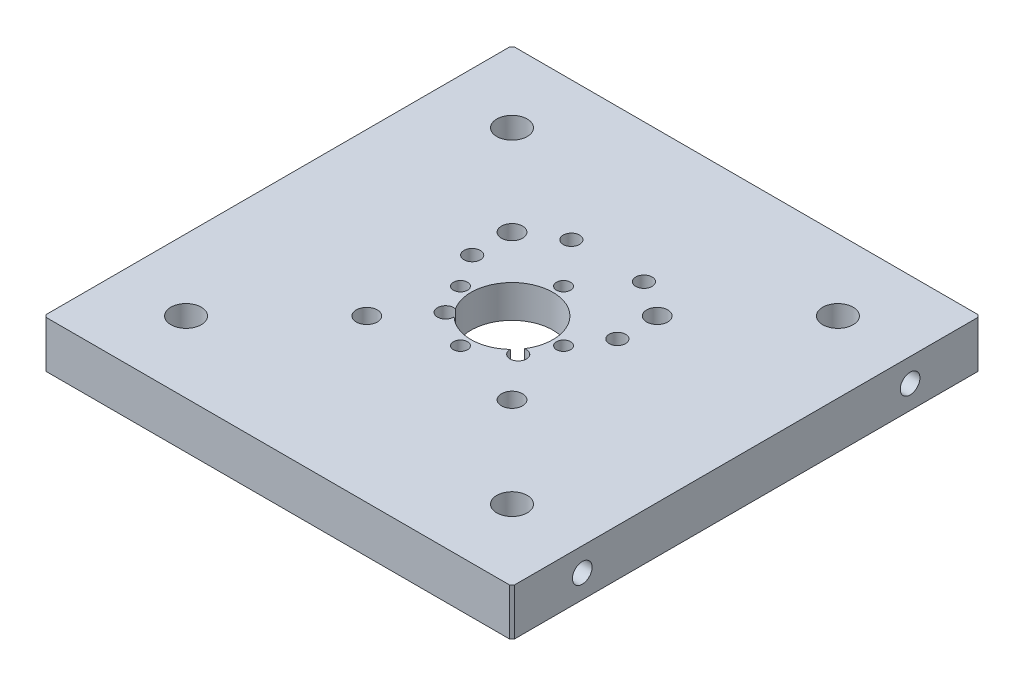
ISO-10303-21;
HEADER;
FILE_DESCRIPTION(('STEP AP214'),'2;1');
FILE_NAME('part.step','',(''),(''),'','','');
FILE_SCHEMA(('AUTOMOTIVE_DESIGN { 1 0 10303 214 1 1 1 1 }'));
ENDSEC;
DATA;
#1=APPLICATION_CONTEXT('core data for automotive mechanical design processes');
#2=APPLICATION_PROTOCOL_DEFINITION('international standard','automotive_design',2000,#1);
#3=PRODUCT_CONTEXT('',#1,'mechanical');
#4=PRODUCT('Part','Part','',(#3));
#5=PRODUCT_RELATED_PRODUCT_CATEGORY('part','',(#4));
#6=PRODUCT_DEFINITION_FORMATION('','',#4);
#7=PRODUCT_DEFINITION_CONTEXT('part definition',#1,'design');
#8=PRODUCT_DEFINITION('design','',#6,#7);
#9=PRODUCT_DEFINITION_SHAPE('','',#8);
#10=(LENGTH_UNIT() NAMED_UNIT(*) SI_UNIT(.MILLI.,.METRE.));
#11=(NAMED_UNIT(*) PLANE_ANGLE_UNIT() SI_UNIT($,.RADIAN.));
#12=(NAMED_UNIT(*) SI_UNIT($,.STERADIAN.) SOLID_ANGLE_UNIT());
#13=UNCERTAINTY_MEASURE_WITH_UNIT(LENGTH_MEASURE(1.E-05),#10,'distance_accuracy_value','');
#14=(GEOMETRIC_REPRESENTATION_CONTEXT(3) GLOBAL_UNCERTAINTY_ASSIGNED_CONTEXT((#13)) GLOBAL_UNIT_ASSIGNED_CONTEXT((#10,
#11,#12)) REPRESENTATION_CONTEXT('',''));
#15=CARTESIAN_POINT('',(0.,0.,0.));
#16=DIRECTION('',(0.,0.,1.));
#17=DIRECTION('',(1.,0.,0.));
#18=AXIS2_PLACEMENT_3D('',#15,#16,#17);
#19=CARTESIAN_POINT('',(0.,-7.7,0.));
#20=DIRECTION('',(0.,1.,0.));
#21=DIRECTION('',(0.,0.,1.));
#22=AXIS2_PLACEMENT_3D('',#19,#20,#21);
#23=CYLINDRICAL_SURFACE('',#22,8.75);
#24=CARTESIAN_POINT('',(0.,-2.,0.));
#25=DIRECTION('',(0.,-1.,0.));
#26=DIRECTION('',(0.,0.,-1.));
#27=AXIS2_PLACEMENT_3D('',#24,#25,#26);
#28=CIRCLE('',#27,8.75);
#29=CARTESIAN_POINT('',(-6.00087551042555,-2.,6.36804468486009));
#30=VERTEX_POINT('',#29);
#31=CARTESIAN_POINT('',(6.00087551042527,-2.,6.36804468486037));
#32=VERTEX_POINT('',#31);
#33=EDGE_CURVE('E191',#30,#32,#28,.F.);
#34=ORIENTED_EDGE('',*,*,#33,.F.);
#35=DIRECTION('',(0.,1.,0.));
#36=VECTOR('',#35,1.);
#37=CARTESIAN_POINT('',(-6.00087551042555,0.,6.36804468486009));
#38=LINE('',#37,#36);
#39=CARTESIAN_POINT('',(-6.00087551042555,5.,6.36804468486009));
#40=VERTEX_POINT('',#39);
#41=EDGE_CURVE('E59',#30,#40,#38,.T.);
#42=ORIENTED_EDGE('',*,*,#41,.T.);
#43=CARTESIAN_POINT('',(0.,5.,0.));
#44=DIRECTION('',(0.,1.,0.));
#45=DIRECTION('',(0.,0.,1.));
#46=AXIS2_PLACEMENT_3D('',#43,#44,#45);
#47=CIRCLE('',#46,8.75);
#48=CARTESIAN_POINT('',(6.00087551042526,5.,6.36804468486037));
#49=VERTEX_POINT('',#48);
#50=EDGE_CURVE('E160',#40,#49,#47,.T.);
#51=ORIENTED_EDGE('',*,*,#50,.T.);
#52=DIRECTION('',(0.,1.,0.));
#53=VECTOR('',#52,1.);
#54=CARTESIAN_POINT('',(6.00087551042526,0.,6.36804468486037));
#55=LINE('',#54,#53);
#56=EDGE_CURVE('E138',#49,#32,#55,.F.);
#57=ORIENTED_EDGE('',*,*,#56,.T.);
#58=EDGE_LOOP('',(#34,#42,#51,#57));
#59=FACE_BOUND('',#58,.T.);
#60=ADVANCED_FACE('F35',(#59),#23,.F.);
#61=CARTESIAN_POINT('',(0.,5.,0.));
#62=DIRECTION('',(0.,1.,0.));
#63=DIRECTION('',(0.,0.,1.));
#64=AXIS2_PLACEMENT_3D('',#61,#62,#63);
#65=PLANE('',#64);
#66=CARTESIAN_POINT('',(0.,5.,-11.));
#67=DIRECTION('',(0.,1.,0.));
#68=DIRECTION('',(0.,0.,1.));
#69=AXIS2_PLACEMENT_3D('',#66,#67,#68);
#70=CIRCLE('',#69,1.5);
#71=CARTESIAN_POINT('',(0.,5.,-9.5));
#72=VERTEX_POINT('',#71);
#73=EDGE_CURVE('E261',#72,#72,#70,.T.);
#74=ORIENTED_EDGE('',*,*,#73,.F.);
#75=EDGE_LOOP('',(#74));
#76=FACE_BOUND('',#75,.T.);
#77=CARTESIAN_POINT('',(-11.,5.,0.));
#78=DIRECTION('',(0.,1.,0.));
#79=DIRECTION('',(0.,0.,1.));
#80=AXIS2_PLACEMENT_3D('',#77,#78,#79);
#81=CIRCLE('',#80,1.5);
#82=CARTESIAN_POINT('',(-11.,5.,1.50000000000002));
#83=VERTEX_POINT('',#82);
#84=EDGE_CURVE('E554',#83,#83,#81,.T.);
#85=ORIENTED_EDGE('',*,*,#84,.F.);
#86=EDGE_LOOP('',(#85));
#87=FACE_BOUND('',#86,.T.);
#88=CARTESIAN_POINT('',(0.,5.,11.));
#89=DIRECTION('',(0.,1.,0.));
#90=DIRECTION('',(0.,0.,1.));
#91=AXIS2_PLACEMENT_3D('',#88,#89,#90);
#92=CIRCLE('',#91,1.5);
#93=CARTESIAN_POINT('',(0.,5.,12.5));
#94=VERTEX_POINT('',#93);
#95=EDGE_CURVE('E557',#94,#94,#92,.T.);
#96=ORIENTED_EDGE('',*,*,#95,.F.);
#97=EDGE_LOOP('',(#96));
#98=FACE_BOUND('',#97,.T.);
#99=CARTESIAN_POINT('',(11.,5.,0.));
#100=DIRECTION('',(0.,1.,0.));
#101=DIRECTION('',(0.,0.,1.));
#102=AXIS2_PLACEMENT_3D('',#99,#100,#101);
#103=CIRCLE('',#102,1.5);
#104=CARTESIAN_POINT('',(11.,5.,1.50000000000002));
#105=VERTEX_POINT('',#104);
#106=EDGE_CURVE('E562',#105,#105,#103,.T.);
#107=ORIENTED_EDGE('',*,*,#106,.F.);
#108=EDGE_LOOP('',(#107));
#109=FACE_BOUND('',#108,.T.);
#110=CARTESIAN_POINT('',(-15.5,5.,15.5));
#111=DIRECTION('',(0.,1.,0.));
#112=DIRECTION('',(0.,0.,1.));
#113=AXIS2_PLACEMENT_3D('',#110,#111,#112);
#114=CIRCLE('',#113,2.25);
#115=CARTESIAN_POINT('',(-15.5,5.,17.75));
#116=VERTEX_POINT('',#115);
#117=EDGE_CURVE('E268',#116,#116,#114,.T.);
#118=ORIENTED_EDGE('',*,*,#117,.F.);
#119=EDGE_LOOP('',(#118));
#120=FACE_BOUND('',#119,.T.);
#121=CARTESIAN_POINT('',(15.4999999999998,5.,15.5000000000002));
#122=DIRECTION('',(0.,1.,0.));
#123=DIRECTION('',(0.,0.,1.));
#124=AXIS2_PLACEMENT_3D('',#121,#122,#123);
#125=CIRCLE('',#124,2.25);
#126=CARTESIAN_POINT('',(15.4999999999998,5.,17.7500000000002));
#127=VERTEX_POINT('',#126);
#128=EDGE_CURVE('E272',#127,#127,#125,.T.);
#129=ORIENTED_EDGE('',*,*,#128,.F.);
#130=EDGE_LOOP('',(#129));
#131=FACE_BOUND('',#130,.T.);
#132=CARTESIAN_POINT('',(15.5000000000001,5.,-15.4999999999999));
#133=DIRECTION('',(0.,1.,0.));
#134=DIRECTION('',(0.,0.,1.));
#135=AXIS2_PLACEMENT_3D('',#132,#133,#134);
#136=CIRCLE('',#135,2.25);
#137=CARTESIAN_POINT('',(15.5000000000001,5.,-13.2499999999999));
#138=VERTEX_POINT('',#137);
#139=EDGE_CURVE('E277',#138,#138,#136,.T.);
#140=ORIENTED_EDGE('',*,*,#139,.F.);
#141=EDGE_LOOP('',(#140));
#142=FACE_BOUND('',#141,.T.);
#143=CARTESIAN_POINT('',(-15.4999999999999,5.,-15.5000000000001));
#144=DIRECTION('',(0.,1.,0.));
#145=DIRECTION('',(0.,0.,1.));
#146=AXIS2_PLACEMENT_3D('',#143,#144,#145);
#147=CIRCLE('',#146,2.25);
#148=CARTESIAN_POINT('',(-15.4999999999999,5.,-13.2500000000001));
#149=VERTEX_POINT('',#148);
#150=EDGE_CURVE('E247',#149,#149,#147,.T.);
#151=ORIENTED_EDGE('',*,*,#150,.F.);
#152=EDGE_LOOP('',(#151));
#153=FACE_BOUND('',#152,.T.);
#154=CARTESIAN_POINT('',(-15.5,5.,-7.));
#155=DIRECTION('',(0.,1.,0.));
#156=DIRECTION('',(0.,0.,1.));
#157=AXIS2_PLACEMENT_3D('',#154,#155,#156);
#158=CIRCLE('',#157,1.75);
#159=CARTESIAN_POINT('',(-15.5,5.,-5.25));
#160=VERTEX_POINT('',#159);
#161=EDGE_CURVE('E256',#160,#160,#158,.T.);
#162=ORIENTED_EDGE('',*,*,#161,.F.);
#163=EDGE_LOOP('',(#162));
#164=FACE_BOUND('',#163,.T.);
#165=CARTESIAN_POINT('',(-7.75000000000016,5.,6.42339375865871));
#166=DIRECTION('',(0.,1.,0.));
#167=DIRECTION('',(0.,0.,1.));
#168=AXIS2_PLACEMENT_3D('',#165,#166,#167);
#169=CIRCLE('',#168,1.75);
#170=CARTESIAN_POINT('',(-7.37102555750396,5.,4.71492123270616));
#171=VERTEX_POINT('',#170);
#172=EDGE_CURVE('E144',#171,#40,#169,.T.);
#173=ORIENTED_EDGE('',*,*,#172,.F.);
#174=CARTESIAN_POINT('',(7.3710255575039,5.,4.71492123270626));
#175=VERTEX_POINT('',#174);
#176=EDGE_CURVE('E151',#175,#171,#47,.T.);
#177=ORIENTED_EDGE('',*,*,#176,.F.);
#178=CARTESIAN_POINT('',(7.74999999999987,5.,6.42339375865887));
#179=DIRECTION('',(0.,1.,0.));
#180=DIRECTION('',(0.,0.,1.));
#181=AXIS2_PLACEMENT_3D('',#178,#179,#180);
#182=CIRCLE('',#181,1.75);
#183=EDGE_CURVE('E135',#49,#175,#182,.T.);
#184=ORIENTED_EDGE('',*,*,#183,.F.);
#185=ORIENTED_EDGE('',*,*,#50,.F.);
#186=EDGE_LOOP('',(#173,#177,#184,#185));
#187=FACE_BOUND('',#186,.T.);
#188=DIRECTION('',(0.,0.,-1.));
#189=VECTOR('',#188,1.);
#190=CARTESIAN_POINT('',(50.,5.,-50.));
#191=LINE('',#190,#189);
#192=CARTESIAN_POINT('',(50.,5.,49.5));
#193=VERTEX_POINT('',#192);
#194=CARTESIAN_POINT('',(50.,5.,-49.5));
#195=VERTEX_POINT('',#194);
#196=EDGE_CURVE('E171',#193,#195,#191,.T.);
#197=ORIENTED_EDGE('',*,*,#196,.T.);
#198=DIRECTION('',(0.707106781186548,0.,0.707106781186548));
#199=VECTOR('',#198,1.);
#200=CARTESIAN_POINT('',(49.75,5.,-49.75));
#201=LINE('',#200,#199);
#202=CARTESIAN_POINT('',(49.5,5.,-50.));
#203=VERTEX_POINT('',#202);
#204=EDGE_CURVE('E203',#195,#203,#201,.F.);
#205=ORIENTED_EDGE('',*,*,#204,.T.);
#206=DIRECTION('',(-1.,0.,0.));
#207=VECTOR('',#206,1.);
#208=CARTESIAN_POINT('',(-50.,5.,-50.));
#209=LINE('',#208,#207);
#210=CARTESIAN_POINT('',(-49.5,5.,-50.));
#211=VERTEX_POINT('',#210);
#212=EDGE_CURVE('E174',#203,#211,#209,.T.);
#213=ORIENTED_EDGE('',*,*,#212,.T.);
#214=DIRECTION('',(0.707106781186548,0.,-0.707106781186548));
#215=VECTOR('',#214,1.);
#216=CARTESIAN_POINT('',(-49.75,5.,-49.75));
#217=LINE('',#216,#215);
#218=CARTESIAN_POINT('',(-50.,5.,-49.5));
#219=VERTEX_POINT('',#218);
#220=EDGE_CURVE('E197',#211,#219,#217,.F.);
#221=ORIENTED_EDGE('',*,*,#220,.T.);
#222=DIRECTION('',(0.,0.,1.));
#223=VECTOR('',#222,1.);
#224=CARTESIAN_POINT('',(-50.,5.,-50.));
#225=LINE('',#224,#223);
#226=CARTESIAN_POINT('',(-50.,5.,49.5));
#227=VERTEX_POINT('',#226);
#228=EDGE_CURVE('E159',#219,#227,#225,.T.);
#229=ORIENTED_EDGE('',*,*,#228,.T.);
#230=DIRECTION('',(-0.707106781186548,0.,-0.707106781186548));
#231=VECTOR('',#230,1.);
#232=CARTESIAN_POINT('',(-49.75,5.,49.75));
#233=LINE('',#232,#231);
#234=CARTESIAN_POINT('',(-49.5,5.,50.));
#235=VERTEX_POINT('',#234);
#236=EDGE_CURVE('E199',#227,#235,#233,.F.);
#237=ORIENTED_EDGE('',*,*,#236,.T.);
#238=DIRECTION('',(1.,0.,0.));
#239=VECTOR('',#238,1.);
#240=CARTESIAN_POINT('',(-50.,5.,50.));
#241=LINE('',#240,#239);
#242=CARTESIAN_POINT('',(49.5,5.,50.));
#243=VERTEX_POINT('',#242);
#244=EDGE_CURVE('E163',#235,#243,#241,.T.);
#245=ORIENTED_EDGE('',*,*,#244,.T.);
#246=DIRECTION('',(-0.707106781186548,0.,0.707106781186548));
#247=VECTOR('',#246,1.);
#248=CARTESIAN_POINT('',(49.75,5.,49.75));
#249=LINE('',#248,#247);
#250=EDGE_CURVE('E201',#243,#193,#249,.F.);
#251=ORIENTED_EDGE('',*,*,#250,.T.);
#252=EDGE_LOOP('',(#197,#205,#213,#221,#229,#237,#245,#251));
#253=FACE_BOUND('',#252,.T.);
#254=CARTESIAN_POINT('',(-34.798492469143,5.,34.798492469143));
#255=DIRECTION('',(0.,1.,0.));
#256=DIRECTION('',(0.,0.,1.));
#257=AXIS2_PLACEMENT_3D('',#254,#255,#256);
#258=CIRCLE('',#257,3.25);
#259=CARTESIAN_POINT('',(-34.798492469143,5.,38.048492469143));
#260=VERTEX_POINT('',#259);
#261=EDGE_CURVE('E324',#260,#260,#258,.T.);
#262=ORIENTED_EDGE('',*,*,#261,.F.);
#263=EDGE_LOOP('',(#262));
#264=FACE_BOUND('',#263,.T.);
#265=CARTESIAN_POINT('',(34.798492469143,5.,34.798492469143));
#266=DIRECTION('',(0.,1.,0.));
#267=DIRECTION('',(0.,0.,-1.));
#268=AXIS2_PLACEMENT_3D('',#265,#266,#267);
#269=CIRCLE('',#268,3.25);
#270=CARTESIAN_POINT('',(34.798492469143,5.,31.548492469143));
#271=VERTEX_POINT('',#270);
#272=EDGE_CURVE('E332',#271,#271,#269,.T.);
#273=ORIENTED_EDGE('',*,*,#272,.F.);
#274=EDGE_LOOP('',(#273));
#275=FACE_BOUND('',#274,.T.);
#276=CARTESIAN_POINT('',(-34.798492469143,5.,-34.798492469143));
#277=DIRECTION('',(0.,1.,0.));
#278=DIRECTION('',(0.,0.,-1.));
#279=AXIS2_PLACEMENT_3D('',#276,#277,#278);
#280=CIRCLE('',#279,3.25);
#281=CARTESIAN_POINT('',(-34.798492469143,5.,-38.048492469143));
#282=VERTEX_POINT('',#281);
#283=EDGE_CURVE('E329',#282,#282,#280,.T.);
#284=ORIENTED_EDGE('',*,*,#283,.F.);
#285=EDGE_LOOP('',(#284));
#286=FACE_BOUND('',#285,.T.);
#287=CARTESIAN_POINT('',(34.798492469143,5.,-34.798492469143));
#288=DIRECTION('',(0.,1.,0.));
#289=DIRECTION('',(0.,0.,1.));
#290=AXIS2_PLACEMENT_3D('',#287,#288,#289);
#291=CIRCLE('',#290,3.25);
#292=CARTESIAN_POINT('',(34.798492469143,5.,-31.548492469143));
#293=VERTEX_POINT('',#292);
#294=EDGE_CURVE('E325',#293,#293,#291,.T.);
#295=ORIENTED_EDGE('',*,*,#294,.F.);
#296=EDGE_LOOP('',(#295));
#297=FACE_BOUND('',#296,.T.);
#298=CARTESIAN_POINT('',(7.75000000000006,5.,-20.4233937586588));
#299=DIRECTION('',(0.,1.,0.));
#300=DIRECTION('',(0.,0.,1.));
#301=AXIS2_PLACEMENT_3D('',#298,#299,#300);
#302=CIRCLE('',#301,1.75);
#303=CARTESIAN_POINT('',(7.75000000000006,5.,-18.6733937586588));
#304=VERTEX_POINT('',#303);
#305=EDGE_CURVE('E232',#304,#304,#302,.T.);
#306=ORIENTED_EDGE('',*,*,#305,.F.);
#307=EDGE_LOOP('',(#306));
#308=FACE_BOUND('',#307,.T.);
#309=CARTESIAN_POINT('',(-7.74999999999997,5.,-20.4233937586588));
#310=DIRECTION('',(0.,1.,0.));
#311=DIRECTION('',(0.,0.,1.));
#312=AXIS2_PLACEMENT_3D('',#309,#310,#311);
#313=CIRCLE('',#312,1.75);
#314=CARTESIAN_POINT('',(-7.74999999999997,5.,-18.6733937586588));
#315=VERTEX_POINT('',#314);
#316=EDGE_CURVE('E283',#315,#315,#313,.T.);
#317=ORIENTED_EDGE('',*,*,#316,.F.);
#318=EDGE_LOOP('',(#317));
#319=FACE_BOUND('',#318,.T.);
#320=CARTESIAN_POINT('',(15.5,5.,-7.00000000000001));
#321=DIRECTION('',(0.,-1.,0.));
#322=DIRECTION('',(0.,0.,-1.));
#323=AXIS2_PLACEMENT_3D('',#320,#321,#322);
#324=CIRCLE('',#323,1.75);
#325=CARTESIAN_POINT('',(15.5,5.,-8.75000000000001));
#326=VERTEX_POINT('',#325);
#327=EDGE_CURVE('E143',#326,#326,#324,.T.);
#328=ORIENTED_EDGE('',*,*,#327,.T.);
#329=EDGE_LOOP('',(#328));
#330=FACE_BOUND('',#329,.T.);
#331=ADVANCED_FACE('F157',(#76,#87,#98,#109,#120,#131,#142,#153,#164,#187,#253,#264,#275,#286,
#297,#308,#319,#330),#65,.T.);
#332=CARTESIAN_POINT('',(0.,-2.,0.));
#333=DIRECTION('',(0.,-1.,0.));
#334=DIRECTION('',(0.,0.,-1.));
#335=AXIS2_PLACEMENT_3D('',#332,#333,#334);
#336=PLANE('',#335);
#337=CARTESIAN_POINT('',(0.,-2.,-11.));
#338=DIRECTION('',(0.,-1.,0.));
#339=DIRECTION('',(0.,0.,-1.));
#340=AXIS2_PLACEMENT_3D('',#337,#338,#339);
#341=CIRCLE('',#340,1.5);
#342=CARTESIAN_POINT('',(0.,-2.,-12.5));
#343=VERTEX_POINT('',#342);
#344=EDGE_CURVE('E39',#343,#343,#341,.T.);
#345=ORIENTED_EDGE('',*,*,#344,.F.);
#346=EDGE_LOOP('',(#345));
#347=FACE_BOUND('',#346,.T.);
#348=CARTESIAN_POINT('',(-11.,-2.,0.));
#349=DIRECTION('',(0.,-1.,0.));
#350=DIRECTION('',(0.,0.,-1.));
#351=AXIS2_PLACEMENT_3D('',#348,#349,#350);
#352=CIRCLE('',#351,1.5);
#353=CARTESIAN_POINT('',(-11.,-2.,-1.49999999999998));
#354=VERTEX_POINT('',#353);
#355=EDGE_CURVE('E263',#354,#354,#352,.T.);
#356=ORIENTED_EDGE('',*,*,#355,.F.);
#357=EDGE_LOOP('',(#356));
#358=FACE_BOUND('',#357,.T.);
#359=CARTESIAN_POINT('',(0.,-2.,11.));
#360=DIRECTION('',(0.,-1.,0.));
#361=DIRECTION('',(0.,0.,-1.));
#362=AXIS2_PLACEMENT_3D('',#359,#360,#361);
#363=CIRCLE('',#362,1.5);
#364=CARTESIAN_POINT('',(0.,-2.,9.5));
#365=VERTEX_POINT('',#364);
#366=EDGE_CURVE('E260',#365,#365,#363,.T.);
#367=ORIENTED_EDGE('',*,*,#366,.F.);
#368=EDGE_LOOP('',(#367));
#369=FACE_BOUND('',#368,.T.);
#370=CARTESIAN_POINT('',(11.,-2.,0.));
#371=DIRECTION('',(0.,-1.,0.));
#372=DIRECTION('',(0.,0.,-1.));
#373=AXIS2_PLACEMENT_3D('',#370,#371,#372);
#374=CIRCLE('',#373,1.5);
#375=CARTESIAN_POINT('',(11.,-2.,-1.49999999999998));
#376=VERTEX_POINT('',#375);
#377=EDGE_CURVE('E257',#376,#376,#374,.T.);
#378=ORIENTED_EDGE('',*,*,#377,.F.);
#379=EDGE_LOOP('',(#378));
#380=FACE_BOUND('',#379,.T.);
#381=CARTESIAN_POINT('',(-15.5,-2.,15.5));
#382=DIRECTION('',(0.,-1.,0.));
#383=DIRECTION('',(0.,0.,-1.));
#384=AXIS2_PLACEMENT_3D('',#381,#382,#383);
#385=CIRCLE('',#384,2.25);
#386=CARTESIAN_POINT('',(-15.5,-2.,13.25));
#387=VERTEX_POINT('',#386);
#388=EDGE_CURVE('E253',#387,#387,#385,.T.);
#389=ORIENTED_EDGE('',*,*,#388,.F.);
#390=EDGE_LOOP('',(#389));
#391=FACE_BOUND('',#390,.T.);
#392=CARTESIAN_POINT('',(15.4999999999998,-2.,15.5000000000002));
#393=DIRECTION('',(0.,-1.,0.));
#394=DIRECTION('',(0.,0.,-1.));
#395=AXIS2_PLACEMENT_3D('',#392,#393,#394);
#396=CIRCLE('',#395,2.25);
#397=CARTESIAN_POINT('',(15.4999999999998,-2.,13.2500000000002));
#398=VERTEX_POINT('',#397);
#399=EDGE_CURVE('E250',#398,#398,#396,.T.);
#400=ORIENTED_EDGE('',*,*,#399,.F.);
#401=EDGE_LOOP('',(#400));
#402=FACE_BOUND('',#401,.T.);
#403=CARTESIAN_POINT('',(15.5000000000001,-2.,-15.4999999999999));
#404=DIRECTION('',(0.,-1.,0.));
#405=DIRECTION('',(0.,0.,-1.));
#406=AXIS2_PLACEMENT_3D('',#403,#404,#405);
#407=CIRCLE('',#406,2.25);
#408=CARTESIAN_POINT('',(15.5000000000001,-2.,-17.7499999999999));
#409=VERTEX_POINT('',#408);
#410=EDGE_CURVE('E246',#409,#409,#407,.T.);
#411=ORIENTED_EDGE('',*,*,#410,.F.);
#412=EDGE_LOOP('',(#411));
#413=FACE_BOUND('',#412,.T.);
#414=CARTESIAN_POINT('',(-15.4999999999999,-2.,-15.5000000000001));
#415=DIRECTION('',(0.,-1.,0.));
#416=DIRECTION('',(0.,0.,-1.));
#417=AXIS2_PLACEMENT_3D('',#414,#415,#416);
#418=CIRCLE('',#417,2.25);
#419=CARTESIAN_POINT('',(-15.4999999999999,-2.,-17.75));
#420=VERTEX_POINT('',#419);
#421=EDGE_CURVE('E243',#420,#420,#418,.T.);
#422=ORIENTED_EDGE('',*,*,#421,.F.);
#423=EDGE_LOOP('',(#422));
#424=FACE_BOUND('',#423,.T.);
#425=CARTESIAN_POINT('',(-15.5,-2.,-7.));
#426=DIRECTION('',(0.,-1.,0.));
#427=DIRECTION('',(0.,0.,-1.));
#428=AXIS2_PLACEMENT_3D('',#425,#426,#427);
#429=CIRCLE('',#428,1.75);
#430=CARTESIAN_POINT('',(-15.5,-2.,-8.75));
#431=VERTEX_POINT('',#430);
#432=EDGE_CURVE('E239',#431,#431,#429,.T.);
#433=ORIENTED_EDGE('',*,*,#432,.F.);
#434=EDGE_LOOP('',(#433));
#435=FACE_BOUND('',#434,.T.);
#436=CARTESIAN_POINT('',(-7.75000000000016,-2.,6.42339375865871));
#437=DIRECTION('',(0.,-1.,0.));
#438=DIRECTION('',(0.,0.,-1.));
#439=AXIS2_PLACEMENT_3D('',#436,#437,#438);
#440=CIRCLE('',#439,1.75);
#441=CARTESIAN_POINT('',(-7.37102555750396,-2.,4.71492123270616));
#442=VERTEX_POINT('',#441);
#443=EDGE_CURVE('E11',#30,#442,#440,.T.);
#444=ORIENTED_EDGE('',*,*,#443,.F.);
#445=ORIENTED_EDGE('',*,*,#33,.T.);
#446=CARTESIAN_POINT('',(7.74999999999987,-2.,6.42339375865887));
#447=DIRECTION('',(0.,-1.,0.));
#448=DIRECTION('',(0.,0.,-1.));
#449=AXIS2_PLACEMENT_3D('',#446,#447,#448);
#450=CIRCLE('',#449,1.75);
#451=CARTESIAN_POINT('',(7.3710255575039,-2.,4.71492123270627));
#452=VERTEX_POINT('',#451);
#453=EDGE_CURVE('E44',#452,#32,#450,.T.);
#454=ORIENTED_EDGE('',*,*,#453,.F.);
#455=EDGE_CURVE('E153',#452,#442,#28,.F.);
#456=ORIENTED_EDGE('',*,*,#455,.T.);
#457=EDGE_LOOP('',(#444,#445,#454,#456));
#458=FACE_BOUND('',#457,.T.);
#459=CARTESIAN_POINT('',(0.,-2.,0.));
#460=DIRECTION('',(0.,-1.,0.));
#461=DIRECTION('',(0.,0.,-1.));
#462=AXIS2_PLACEMENT_3D('',#459,#460,#461);
#463=CIRCLE('',#462,37.5);
#464=CARTESIAN_POINT('',(0.,-2.,-37.5));
#465=VERTEX_POINT('',#464);
#466=EDGE_CURVE('E192',#465,#465,#463,.T.);
#467=ORIENTED_EDGE('',*,*,#466,.T.);
#468=EDGE_LOOP('',(#467));
#469=FACE_BOUND('',#468,.T.);
#470=CARTESIAN_POINT('',(7.75000000000006,-2.,-20.4233937586588));
#471=DIRECTION('',(0.,-1.,0.));
#472=DIRECTION('',(0.,0.,-1.));
#473=AXIS2_PLACEMENT_3D('',#470,#471,#472);
#474=CIRCLE('',#473,1.75);
#475=CARTESIAN_POINT('',(7.75000000000006,-2.,-22.1733937586588));
#476=VERTEX_POINT('',#475);
#477=EDGE_CURVE('E228',#476,#476,#474,.T.);
#478=ORIENTED_EDGE('',*,*,#477,.F.);
#479=EDGE_LOOP('',(#478));
#480=FACE_BOUND('',#479,.T.);
#481=CARTESIAN_POINT('',(-7.74999999999997,-2.,-20.4233937586588));
#482=DIRECTION('',(0.,-1.,0.));
#483=DIRECTION('',(0.,0.,-1.));
#484=AXIS2_PLACEMENT_3D('',#481,#482,#483);
#485=CIRCLE('',#484,1.75);
#486=CARTESIAN_POINT('',(-7.74999999999997,-2.,-22.1733937586588));
#487=VERTEX_POINT('',#486);
#488=EDGE_CURVE('E231',#487,#487,#485,.T.);
#489=ORIENTED_EDGE('',*,*,#488,.F.);
#490=EDGE_LOOP('',(#489));
#491=FACE_BOUND('',#490,.T.);
#492=CARTESIAN_POINT('',(15.5,-2.,-7.00000000000001));
#493=DIRECTION('',(0.,-1.,0.));
#494=DIRECTION('',(0.,0.,-1.));
#495=AXIS2_PLACEMENT_3D('',#492,#493,#494);
#496=CIRCLE('',#495,1.75);
#497=CARTESIAN_POINT('',(15.5,-2.,-8.75000000000001));
#498=VERTEX_POINT('',#497);
#499=EDGE_CURVE('E235',#498,#498,#496,.F.);
#500=ORIENTED_EDGE('',*,*,#499,.T.);
#501=EDGE_LOOP('',(#500));
#502=FACE_BOUND('',#501,.T.);
#503=ADVANCED_FACE('F372',(#347,#358,#369,#380,#391,#402,#413,#424,#435,#458,#469,#480,#491,
#502),#336,.T.);
#504=ORIENTED_EDGE('',*,*,#176,.T.);
#505=DIRECTION('',(0.,1.,0.));
#506=VECTOR('',#505,1.);
#507=CARTESIAN_POINT('',(-7.37102555750396,0.,4.71492123270616));
#508=LINE('',#507,#506);
#509=EDGE_CURVE('E154',#171,#442,#508,.F.);
#510=ORIENTED_EDGE('',*,*,#509,.T.);
#511=ORIENTED_EDGE('',*,*,#455,.F.);
#512=DIRECTION('',(0.,1.,0.));
#513=VECTOR('',#512,1.);
#514=CARTESIAN_POINT('',(7.3710255575039,0.,4.71492123270626));
#515=LINE('',#514,#513);
#516=EDGE_CURVE('E52',#452,#175,#515,.T.);
#517=ORIENTED_EDGE('',*,*,#516,.T.);
#518=EDGE_LOOP('',(#504,#510,#511,#517));
#519=FACE_BOUND('',#518,.T.);
#520=ADVANCED_FACE('F149',(#519),#23,.F.);
#521=CARTESIAN_POINT('',(-50.,-5.,-50.));
#522=DIRECTION('',(-1.,0.,0.));
#523=DIRECTION('',(0.,0.,1.));
#524=AXIS2_PLACEMENT_3D('',#521,#522,#523);
#525=PLANE('',#524);
#526=CARTESIAN_POINT('',(-50.,0.,-35.));
#527=DIRECTION('',(-1.,0.,0.));
#528=DIRECTION('',(0.,0.,1.));
#529=AXIS2_PLACEMENT_3D('',#526,#527,#528);
#530=CIRCLE('',#529,2.1);
#531=CARTESIAN_POINT('',(-50.,0.,-32.9));
#532=VERTEX_POINT('',#531);
#533=EDGE_CURVE('E312',#532,#532,#530,.T.);
#534=ORIENTED_EDGE('',*,*,#533,.F.);
#535=EDGE_LOOP('',(#534));
#536=FACE_BOUND('',#535,.T.);
#537=CARTESIAN_POINT('',(-50.,0.,35.));
#538=DIRECTION('',(-1.,0.,0.));
#539=DIRECTION('',(0.,0.,1.));
#540=AXIS2_PLACEMENT_3D('',#537,#538,#539);
#541=CIRCLE('',#540,2.1);
#542=CARTESIAN_POINT('',(-50.,0.,37.1));
#543=VERTEX_POINT('',#542);
#544=EDGE_CURVE('E318',#543,#543,#541,.T.);
#545=ORIENTED_EDGE('',*,*,#544,.F.);
#546=EDGE_LOOP('',(#545));
#547=FACE_BOUND('',#546,.T.);
#548=DIRECTION('',(0.,0.,1.));
#549=VECTOR('',#548,1.);
#550=CARTESIAN_POINT('',(-50.,-5.,-50.));
#551=LINE('',#550,#549);
#552=CARTESIAN_POINT('',(-50.,-5.,-49.5));
#553=VERTEX_POINT('',#552);
#554=CARTESIAN_POINT('',(-50.,-5.,49.5));
#555=VERTEX_POINT('',#554);
#556=EDGE_CURVE('E177',#553,#555,#551,.T.);
#557=ORIENTED_EDGE('',*,*,#556,.T.);
#558=DIRECTION('',(0.,1.,0.));
#559=VECTOR('',#558,1.);
#560=CARTESIAN_POINT('',(-50.,-5.,49.5));
#561=LINE('',#560,#559);
#562=EDGE_CURVE('E225',#555,#227,#561,.T.);
#563=ORIENTED_EDGE('',*,*,#562,.T.);
#564=ORIENTED_EDGE('',*,*,#228,.F.);
#565=DIRECTION('',(0.,-1.,0.));
#566=VECTOR('',#565,1.);
#567=CARTESIAN_POINT('',(-50.,-5.,-49.5));
#568=LINE('',#567,#566);
#569=EDGE_CURVE('E223',#219,#553,#568,.T.);
#570=ORIENTED_EDGE('',*,*,#569,.T.);
#571=EDGE_LOOP('',(#557,#563,#564,#570));
#572=FACE_BOUND('',#571,.T.);
#573=ADVANCED_FACE('F378',(#536,#547,#572),#525,.T.);
#574=CARTESIAN_POINT('',(-50.,-5.,-50.));
#575=DIRECTION('',(0.,0.,-1.));
#576=DIRECTION('',(-1.,0.,0.));
#577=AXIS2_PLACEMENT_3D('',#574,#575,#576);
#578=PLANE('',#577);
#579=ORIENTED_EDGE('',*,*,#212,.F.);
#580=DIRECTION('',(0.,-1.,0.));
#581=VECTOR('',#580,1.);
#582=CARTESIAN_POINT('',(49.5,-5.,-50.));
#583=LINE('',#582,#581);
#584=CARTESIAN_POINT('',(49.5,-5.,-50.));
#585=VERTEX_POINT('',#584);
#586=EDGE_CURVE('E208',#203,#585,#583,.T.);
#587=ORIENTED_EDGE('',*,*,#586,.T.);
#588=DIRECTION('',(-1.,0.,0.));
#589=VECTOR('',#588,1.);
#590=CARTESIAN_POINT('',(-50.,-5.,-50.));
#591=LINE('',#590,#589);
#592=CARTESIAN_POINT('',(-49.5,-5.,-50.));
#593=VERTEX_POINT('',#592);
#594=EDGE_CURVE('E186',#585,#593,#591,.T.);
#595=ORIENTED_EDGE('',*,*,#594,.T.);
#596=DIRECTION('',(0.,1.,0.));
#597=VECTOR('',#596,1.);
#598=CARTESIAN_POINT('',(-49.5,-5.,-50.));
#599=LINE('',#598,#597);
#600=EDGE_CURVE('E205',#593,#211,#599,.T.);
#601=ORIENTED_EDGE('',*,*,#600,.T.);
#602=EDGE_LOOP('',(#579,#587,#595,#601));
#603=FACE_BOUND('',#602,.T.);
#604=ADVANCED_FACE('F383',(#603),#578,.T.);
#605=CARTESIAN_POINT('',(50.,-5.,-50.));
#606=DIRECTION('',(1.,0.,0.));
#607=DIRECTION('',(0.,0.,-1.));
#608=AXIS2_PLACEMENT_3D('',#605,#606,#607);
#609=PLANE('',#608);
#610=CARTESIAN_POINT('',(50.,0.,-35.));
#611=DIRECTION('',(1.,0.,0.));
#612=DIRECTION('',(0.,0.,-1.));
#613=AXIS2_PLACEMENT_3D('',#610,#611,#612);
#614=CIRCLE('',#613,2.1);
#615=CARTESIAN_POINT('',(50.,0.,-37.1));
#616=VERTEX_POINT('',#615);
#617=EDGE_CURVE('E242',#616,#616,#614,.T.);
#618=ORIENTED_EDGE('',*,*,#617,.F.);
#619=EDGE_LOOP('',(#618));
#620=FACE_BOUND('',#619,.T.);
#621=CARTESIAN_POINT('',(50.,0.,35.));
#622=DIRECTION('',(1.,0.,0.));
#623=DIRECTION('',(0.,0.,-1.));
#624=AXIS2_PLACEMENT_3D('',#621,#622,#623);
#625=CIRCLE('',#624,2.1);
#626=CARTESIAN_POINT('',(50.,0.,32.9));
#627=VERTEX_POINT('',#626);
#628=EDGE_CURVE('E301',#627,#627,#625,.T.);
#629=ORIENTED_EDGE('',*,*,#628,.F.);
#630=EDGE_LOOP('',(#629));
#631=FACE_BOUND('',#630,.T.);
#632=DIRECTION('',(0.,0.,-1.));
#633=VECTOR('',#632,1.);
#634=CARTESIAN_POINT('',(50.,-5.,-50.));
#635=LINE('',#634,#633);
#636=CARTESIAN_POINT('',(50.,-5.,49.5));
#637=VERTEX_POINT('',#636);
#638=CARTESIAN_POINT('',(50.,-5.,-49.5));
#639=VERTEX_POINT('',#638);
#640=EDGE_CURVE('E183',#637,#639,#635,.T.);
#641=ORIENTED_EDGE('',*,*,#640,.T.);
#642=DIRECTION('',(0.,1.,0.));
#643=VECTOR('',#642,1.);
#644=CARTESIAN_POINT('',(50.,-5.,-49.5));
#645=LINE('',#644,#643);
#646=EDGE_CURVE('E194',#639,#195,#645,.T.);
#647=ORIENTED_EDGE('',*,*,#646,.T.);
#648=ORIENTED_EDGE('',*,*,#196,.F.);
#649=DIRECTION('',(0.,-1.,0.));
#650=VECTOR('',#649,1.);
#651=CARTESIAN_POINT('',(50.,-5.,49.5));
#652=LINE('',#651,#650);
#653=EDGE_CURVE('E189',#193,#637,#652,.T.);
#654=ORIENTED_EDGE('',*,*,#653,.T.);
#655=EDGE_LOOP('',(#641,#647,#648,#654));
#656=FACE_BOUND('',#655,.T.);
#657=ADVANCED_FACE('F439',(#620,#631,#656),#609,.T.);
#658=CARTESIAN_POINT('',(-50.,-5.,50.));
#659=DIRECTION('',(0.,0.,1.));
#660=DIRECTION('',(1.,0.,0.));
#661=AXIS2_PLACEMENT_3D('',#658,#659,#660);
#662=PLANE('',#661);
#663=DIRECTION('',(1.,0.,0.));
#664=VECTOR('',#663,1.);
#665=CARTESIAN_POINT('',(-50.,-5.,50.));
#666=LINE('',#665,#664);
#667=CARTESIAN_POINT('',(-49.5,-5.,50.));
#668=VERTEX_POINT('',#667);
#669=CARTESIAN_POINT('',(49.5,-5.,50.));
#670=VERTEX_POINT('',#669);
#671=EDGE_CURVE('E180',#668,#670,#666,.T.);
#672=ORIENTED_EDGE('',*,*,#671,.T.);
#673=DIRECTION('',(0.,1.,0.));
#674=VECTOR('',#673,1.);
#675=CARTESIAN_POINT('',(49.5,-5.,50.));
#676=LINE('',#675,#674);
#677=EDGE_CURVE('E220',#670,#243,#676,.T.);
#678=ORIENTED_EDGE('',*,*,#677,.T.);
#679=ORIENTED_EDGE('',*,*,#244,.F.);
#680=DIRECTION('',(0.,-1.,0.));
#681=VECTOR('',#680,1.);
#682=CARTESIAN_POINT('',(-49.5,-5.,50.));
#683=LINE('',#682,#681);
#684=EDGE_CURVE('E218',#235,#668,#683,.T.);
#685=ORIENTED_EDGE('',*,*,#684,.T.);
#686=EDGE_LOOP('',(#672,#678,#679,#685));
#687=FACE_BOUND('',#686,.T.);
#688=ADVANCED_FACE('F430',(#687),#662,.T.);
#689=CARTESIAN_POINT('',(0.,-5.,0.));
#690=DIRECTION('',(0.,1.,0.));
#691=DIRECTION('',(0.,0.,1.));
#692=AXIS2_PLACEMENT_3D('',#689,#690,#691);
#693=PLANE('',#692);
#694=CARTESIAN_POINT('',(0.,-5.,0.));
#695=DIRECTION('',(0.,-1.,0.));
#696=DIRECTION('',(0.,0.,-1.));
#697=AXIS2_PLACEMENT_3D('',#694,#695,#696);
#698=CIRCLE('',#697,37.5);
#699=CARTESIAN_POINT('',(0.,-5.,-37.5));
#700=VERTEX_POINT('',#699);
#701=EDGE_CURVE('E307',#700,#700,#698,.T.);
#702=ORIENTED_EDGE('',*,*,#701,.F.);
#703=EDGE_LOOP('',(#702));
#704=FACE_BOUND('',#703,.T.);
#705=CARTESIAN_POINT('',(34.798492469143,-5.,-34.798492469143));
#706=DIRECTION('',(0.,1.,0.));
#707=DIRECTION('',(0.,0.,1.));
#708=AXIS2_PLACEMENT_3D('',#705,#706,#707);
#709=CIRCLE('',#708,3.25);
#710=CARTESIAN_POINT('',(34.798492469143,-5.,-31.548492469143));
#711=VERTEX_POINT('',#710);
#712=EDGE_CURVE('E165',#711,#711,#709,.T.);
#713=ORIENTED_EDGE('',*,*,#712,.T.);
#714=EDGE_LOOP('',(#713));
#715=FACE_BOUND('',#714,.T.);
#716=CARTESIAN_POINT('',(-34.798492469143,-5.,-34.798492469143));
#717=DIRECTION('',(0.,1.,0.));
#718=DIRECTION('',(0.,0.,1.));
#719=AXIS2_PLACEMENT_3D('',#716,#717,#718);
#720=CIRCLE('',#719,3.25);
#721=CARTESIAN_POINT('',(-34.798492469143,-5.,-31.548492469143));
#722=VERTEX_POINT('',#721);
#723=EDGE_CURVE('E341',#722,#722,#720,.T.);
#724=ORIENTED_EDGE('',*,*,#723,.T.);
#725=EDGE_LOOP('',(#724));
#726=FACE_BOUND('',#725,.T.);
#727=CARTESIAN_POINT('',(34.798492469143,-5.,34.798492469143));
#728=DIRECTION('',(0.,1.,0.));
#729=DIRECTION('',(0.,0.,1.));
#730=AXIS2_PLACEMENT_3D('',#727,#728,#729);
#731=CIRCLE('',#730,3.25);
#732=CARTESIAN_POINT('',(34.798492469143,-5.,38.048492469143));
#733=VERTEX_POINT('',#732);
#734=EDGE_CURVE('E339',#733,#733,#731,.T.);
#735=ORIENTED_EDGE('',*,*,#734,.T.);
#736=EDGE_LOOP('',(#735));
#737=FACE_BOUND('',#736,.T.);
#738=CARTESIAN_POINT('',(-34.798492469143,-5.,34.798492469143));
#739=DIRECTION('',(0.,1.,0.));
#740=DIRECTION('',(0.,0.,1.));
#741=AXIS2_PLACEMENT_3D('',#738,#739,#740);
#742=CIRCLE('',#741,3.25);
#743=CARTESIAN_POINT('',(-34.798492469143,-5.,38.048492469143));
#744=VERTEX_POINT('',#743);
#745=EDGE_CURVE('E328',#744,#744,#742,.T.);
#746=ORIENTED_EDGE('',*,*,#745,.T.);
#747=EDGE_LOOP('',(#746));
#748=FACE_BOUND('',#747,.T.);
#749=ORIENTED_EDGE('',*,*,#594,.F.);
#750=DIRECTION('',(-0.707106781186548,0.,-0.707106781186548));
#751=VECTOR('',#750,1.);
#752=CARTESIAN_POINT('',(50.,-5.,-49.5));
#753=LINE('',#752,#751);
#754=EDGE_CURVE('E216',#585,#639,#753,.F.);
#755=ORIENTED_EDGE('',*,*,#754,.T.);
#756=ORIENTED_EDGE('',*,*,#640,.F.);
#757=DIRECTION('',(0.707106781186548,0.,-0.707106781186548));
#758=VECTOR('',#757,1.);
#759=CARTESIAN_POINT('',(49.5,-5.,50.));
#760=LINE('',#759,#758);
#761=EDGE_CURVE('E214',#637,#670,#760,.F.);
#762=ORIENTED_EDGE('',*,*,#761,.T.);
#763=ORIENTED_EDGE('',*,*,#671,.F.);
#764=DIRECTION('',(0.707106781186548,0.,0.707106781186548));
#765=VECTOR('',#764,1.);
#766=CARTESIAN_POINT('',(-50.,-5.,49.5));
#767=LINE('',#766,#765);
#768=EDGE_CURVE('E212',#668,#555,#767,.F.);
#769=ORIENTED_EDGE('',*,*,#768,.T.);
#770=ORIENTED_EDGE('',*,*,#556,.F.);
#771=DIRECTION('',(-0.707106781186548,0.,0.707106781186548));
#772=VECTOR('',#771,1.);
#773=CARTESIAN_POINT('',(-49.5,-5.,-50.));
#774=LINE('',#773,#772);
#775=EDGE_CURVE('E210',#553,#593,#774,.F.);
#776=ORIENTED_EDGE('',*,*,#775,.T.);
#777=EDGE_LOOP('',(#749,#755,#756,#762,#763,#769,#770,#776));
#778=FACE_BOUND('',#777,.T.);
#779=ADVANCED_FACE('F348',(#704,#715,#726,#737,#748,#778),#693,.F.);
#780=CARTESIAN_POINT('',(-34.798492469143,-7.7,34.798492469143));
#781=DIRECTION('',(0.,1.,0.));
#782=DIRECTION('',(0.,0.,1.));
#783=AXIS2_PLACEMENT_3D('',#780,#781,#782);
#784=CYLINDRICAL_SURFACE('',#783,3.25);
#785=ORIENTED_EDGE('',*,*,#261,.T.);
#786=EDGE_LOOP('',(#785));
#787=FACE_BOUND('',#786,.T.);
#788=ORIENTED_EDGE('',*,*,#745,.F.);
#789=EDGE_LOOP('',(#788));
#790=FACE_BOUND('',#789,.T.);
#791=ADVANCED_FACE('F451',(#787,#790),#784,.F.);
#792=CARTESIAN_POINT('',(34.798492469143,-7.7,34.798492469143));
#793=DIRECTION('',(0.,1.,0.));
#794=DIRECTION('',(0.,0.,1.));
#795=AXIS2_PLACEMENT_3D('',#792,#793,#794);
#796=CYLINDRICAL_SURFACE('',#795,3.25);
#797=ORIENTED_EDGE('',*,*,#272,.T.);
#798=EDGE_LOOP('',(#797));
#799=FACE_BOUND('',#798,.T.);
#800=ORIENTED_EDGE('',*,*,#734,.F.);
#801=EDGE_LOOP('',(#800));
#802=FACE_BOUND('',#801,.T.);
#803=ADVANCED_FACE('F363',(#799,#802),#796,.F.);
#804=CARTESIAN_POINT('',(-34.798492469143,-7.7,-34.798492469143));
#805=DIRECTION('',(0.,1.,0.));
#806=DIRECTION('',(0.,0.,1.));
#807=AXIS2_PLACEMENT_3D('',#804,#805,#806);
#808=CYLINDRICAL_SURFACE('',#807,3.25);
#809=ORIENTED_EDGE('',*,*,#283,.T.);
#810=EDGE_LOOP('',(#809));
#811=FACE_BOUND('',#810,.T.);
#812=ORIENTED_EDGE('',*,*,#723,.F.);
#813=EDGE_LOOP('',(#812));
#814=FACE_BOUND('',#813,.T.);
#815=ADVANCED_FACE('F353',(#811,#814),#808,.F.);
#816=CARTESIAN_POINT('',(34.798492469143,-7.7,-34.798492469143));
#817=DIRECTION('',(0.,1.,0.));
#818=DIRECTION('',(0.,0.,1.));
#819=AXIS2_PLACEMENT_3D('',#816,#817,#818);
#820=CYLINDRICAL_SURFACE('',#819,3.25);
#821=ORIENTED_EDGE('',*,*,#294,.T.);
#822=EDGE_LOOP('',(#821));
#823=FACE_BOUND('',#822,.T.);
#824=ORIENTED_EDGE('',*,*,#712,.F.);
#825=EDGE_LOOP('',(#824));
#826=FACE_BOUND('',#825,.T.);
#827=ADVANCED_FACE('F350',(#823,#826),#820,.F.);
#828=CARTESIAN_POINT('',(-40.,0.,35.));
#829=DIRECTION('',(-1.,0.,0.));
#830=DIRECTION('',(0.,0.,1.));
#831=AXIS2_PLACEMENT_3D('',#828,#829,#830);
#832=CONICAL_SURFACE('',#831,2.1,1.02974425867665);
#833=CARTESIAN_POINT('',(-38.7381927000421,0.,35.));
#834=VERTEX_POINT('',#833);
#835=VERTEX_LOOP('',#834);
#836=FACE_BOUND('',#835,.T.);
#837=CARTESIAN_POINT('',(-40.,0.,35.));
#838=DIRECTION('',(-1.,0.,0.));
#839=DIRECTION('',(0.,0.,1.));
#840=AXIS2_PLACEMENT_3D('',#837,#838,#839);
#841=CIRCLE('',#840,2.1);
#842=CARTESIAN_POINT('',(-40.,0.,37.1));
#843=VERTEX_POINT('',#842);
#844=EDGE_CURVE('E321',#843,#843,#841,.T.);
#845=ORIENTED_EDGE('',*,*,#844,.T.);
#846=EDGE_LOOP('',(#845));
#847=FACE_BOUND('',#846,.T.);
#848=ADVANCED_FACE('F352',(#836,#847),#832,.F.);
#849=CARTESIAN_POINT('',(-50.,0.,35.));
#850=DIRECTION('',(-1.,0.,0.));
#851=DIRECTION('',(0.,0.,1.));
#852=AXIS2_PLACEMENT_3D('',#849,#850,#851);
#853=CYLINDRICAL_SURFACE('',#852,2.1);
#854=ORIENTED_EDGE('',*,*,#844,.F.);
#855=EDGE_LOOP('',(#854));
#856=FACE_BOUND('',#855,.T.);
#857=ORIENTED_EDGE('',*,*,#544,.T.);
#858=EDGE_LOOP('',(#857));
#859=FACE_BOUND('',#858,.T.);
#860=ADVANCED_FACE('F360',(#856,#859),#853,.F.);
#861=CARTESIAN_POINT('',(-40.,0.,-35.));
#862=DIRECTION('',(-1.,0.,0.));
#863=DIRECTION('',(0.,0.,1.));
#864=AXIS2_PLACEMENT_3D('',#861,#862,#863);
#865=CONICAL_SURFACE('',#864,2.1,1.02974425867665);
#866=CARTESIAN_POINT('',(-38.7381927000421,0.,-35.));
#867=VERTEX_POINT('',#866);
#868=VERTEX_LOOP('',#867);
#869=FACE_BOUND('',#868,.T.);
#870=CARTESIAN_POINT('',(-40.,0.,-35.));
#871=DIRECTION('',(-1.,0.,0.));
#872=DIRECTION('',(0.,0.,1.));
#873=AXIS2_PLACEMENT_3D('',#870,#871,#872);
#874=CIRCLE('',#873,2.1);
#875=CARTESIAN_POINT('',(-40.,0.,-32.9));
#876=VERTEX_POINT('',#875);
#877=EDGE_CURVE('E315',#876,#876,#874,.T.);
#878=ORIENTED_EDGE('',*,*,#877,.T.);
#879=EDGE_LOOP('',(#878));
#880=FACE_BOUND('',#879,.T.);
#881=ADVANCED_FACE('F403',(#869,#880),#865,.F.);
#882=CARTESIAN_POINT('',(-50.,0.,-35.));
#883=DIRECTION('',(-1.,0.,0.));
#884=DIRECTION('',(0.,0.,1.));
#885=AXIS2_PLACEMENT_3D('',#882,#883,#884);
#886=CYLINDRICAL_SURFACE('',#885,2.1);
#887=ORIENTED_EDGE('',*,*,#877,.F.);
#888=EDGE_LOOP('',(#887));
#889=FACE_BOUND('',#888,.T.);
#890=ORIENTED_EDGE('',*,*,#533,.T.);
#891=EDGE_LOOP('',(#890));
#892=FACE_BOUND('',#891,.T.);
#893=ADVANCED_FACE('F399',(#889,#892),#886,.F.);
#894=CARTESIAN_POINT('',(0.,-2.,0.));
#895=DIRECTION('',(0.,-1.,0.));
#896=DIRECTION('',(0.,0.,-1.));
#897=AXIS2_PLACEMENT_3D('',#894,#895,#896);
#898=CYLINDRICAL_SURFACE('',#897,37.5);
#899=ORIENTED_EDGE('',*,*,#466,.F.);
#900=EDGE_LOOP('',(#899));
#901=FACE_BOUND('',#900,.T.);
#902=ORIENTED_EDGE('',*,*,#701,.T.);
#903=EDGE_LOOP('',(#902));
#904=FACE_BOUND('',#903,.T.);
#905=ADVANCED_FACE('F395',(#901,#904),#898,.F.);
#906=CARTESIAN_POINT('',(50.,-5.,-49.5));
#907=DIRECTION('',(-0.707106781186548,0.,0.707106781186548));
#908=DIRECTION('',(0.,1.,0.));
#909=AXIS2_PLACEMENT_3D('',#906,#907,#908);
#910=PLANE('',#909);
#911=ORIENTED_EDGE('',*,*,#754,.F.);
#912=ORIENTED_EDGE('',*,*,#586,.F.);
#913=ORIENTED_EDGE('',*,*,#204,.F.);
#914=ORIENTED_EDGE('',*,*,#646,.F.);
#915=EDGE_LOOP('',(#911,#912,#913,#914));
#916=FACE_BOUND('',#915,.T.);
#917=ADVANCED_FACE('F398',(#916),#910,.F.);
#918=CARTESIAN_POINT('',(49.5,-5.,50.));
#919=DIRECTION('',(-0.707106781186547,0.,-0.707106781186547));
#920=DIRECTION('',(0.,1.,0.));
#921=AXIS2_PLACEMENT_3D('',#918,#919,#920);
#922=PLANE('',#921);
#923=ORIENTED_EDGE('',*,*,#761,.F.);
#924=ORIENTED_EDGE('',*,*,#653,.F.);
#925=ORIENTED_EDGE('',*,*,#250,.F.);
#926=ORIENTED_EDGE('',*,*,#677,.F.);
#927=EDGE_LOOP('',(#923,#924,#925,#926));
#928=FACE_BOUND('',#927,.T.);
#929=ADVANCED_FACE('F435',(#928),#922,.F.);
#930=CARTESIAN_POINT('',(-50.,-5.,49.5));
#931=DIRECTION('',(0.707106781186547,0.,-0.707106781186547));
#932=DIRECTION('',(0.,1.,0.));
#933=AXIS2_PLACEMENT_3D('',#930,#931,#932);
#934=PLANE('',#933);
#935=ORIENTED_EDGE('',*,*,#768,.F.);
#936=ORIENTED_EDGE('',*,*,#684,.F.);
#937=ORIENTED_EDGE('',*,*,#236,.F.);
#938=ORIENTED_EDGE('',*,*,#562,.F.);
#939=EDGE_LOOP('',(#935,#936,#937,#938));
#940=FACE_BOUND('',#939,.T.);
#941=ADVANCED_FACE('F425',(#940),#934,.F.);
#942=CARTESIAN_POINT('',(-49.5,-5.,-50.));
#943=DIRECTION('',(0.707106781186547,0.,0.707106781186547));
#944=DIRECTION('',(0.,1.,0.));
#945=AXIS2_PLACEMENT_3D('',#942,#943,#944);
#946=PLANE('',#945);
#947=ORIENTED_EDGE('',*,*,#775,.F.);
#948=ORIENTED_EDGE('',*,*,#569,.F.);
#949=ORIENTED_EDGE('',*,*,#220,.F.);
#950=ORIENTED_EDGE('',*,*,#600,.F.);
#951=EDGE_LOOP('',(#947,#948,#949,#950));
#952=FACE_BOUND('',#951,.T.);
#953=ADVANCED_FACE('F37',(#952),#946,.F.);
#954=CARTESIAN_POINT('',(40.,0.,35.));
#955=DIRECTION('',(1.,0.,0.));
#956=DIRECTION('',(0.,0.,-1.));
#957=AXIS2_PLACEMENT_3D('',#954,#955,#956);
#958=CONICAL_SURFACE('',#957,2.1,1.02974425867665);
#959=CARTESIAN_POINT('',(38.7381927000421,0.,35.));
#960=VERTEX_POINT('',#959);
#961=VERTEX_LOOP('',#960);
#962=FACE_BOUND('',#961,.T.);
#963=CARTESIAN_POINT('',(40.,0.,35.));
#964=DIRECTION('',(1.,0.,0.));
#965=DIRECTION('',(0.,0.,-1.));
#966=AXIS2_PLACEMENT_3D('',#963,#964,#965);
#967=CIRCLE('',#966,2.1);
#968=CARTESIAN_POINT('',(40.,0.,32.9));
#969=VERTEX_POINT('',#968);
#970=EDGE_CURVE('E304',#969,#969,#967,.T.);
#971=ORIENTED_EDGE('',*,*,#970,.T.);
#972=EDGE_LOOP('',(#971));
#973=FACE_BOUND('',#972,.T.);
#974=ADVANCED_FACE('F393',(#962,#973),#958,.F.);
#975=CARTESIAN_POINT('',(50.,0.,35.));
#976=DIRECTION('',(1.,0.,0.));
#977=DIRECTION('',(0.,0.,-1.));
#978=AXIS2_PLACEMENT_3D('',#975,#976,#977);
#979=CYLINDRICAL_SURFACE('',#978,2.1);
#980=ORIENTED_EDGE('',*,*,#970,.F.);
#981=EDGE_LOOP('',(#980));
#982=FACE_BOUND('',#981,.T.);
#983=ORIENTED_EDGE('',*,*,#628,.T.);
#984=EDGE_LOOP('',(#983));
#985=FACE_BOUND('',#984,.T.);
#986=ADVANCED_FACE('F477',(#982,#985),#979,.F.);
#987=CARTESIAN_POINT('',(40.,0.,-35.));
#988=DIRECTION('',(1.,0.,0.));
#989=DIRECTION('',(0.,0.,-1.));
#990=AXIS2_PLACEMENT_3D('',#987,#988,#989);
#991=CONICAL_SURFACE('',#990,2.1,1.02974425867665);
#992=CARTESIAN_POINT('',(38.7381927000421,0.,-35.));
#993=VERTEX_POINT('',#992);
#994=VERTEX_LOOP('',#993);
#995=FACE_BOUND('',#994,.T.);
#996=CARTESIAN_POINT('',(40.,0.,-35.));
#997=DIRECTION('',(1.,0.,0.));
#998=DIRECTION('',(0.,0.,-1.));
#999=AXIS2_PLACEMENT_3D('',#996,#997,#998);
#1000=CIRCLE('',#999,2.1);
#1001=CARTESIAN_POINT('',(40.,0.,-37.1));
#1002=VERTEX_POINT('',#1001);
#1003=EDGE_CURVE('E298',#1002,#1002,#1000,.T.);
#1004=ORIENTED_EDGE('',*,*,#1003,.T.);
#1005=EDGE_LOOP('',(#1004));
#1006=FACE_BOUND('',#1005,.T.);
#1007=ADVANCED_FACE('F482',(#995,#1006),#991,.F.);
#1008=CARTESIAN_POINT('',(50.,0.,-35.));
#1009=DIRECTION('',(1.,0.,0.));
#1010=DIRECTION('',(0.,0.,-1.));
#1011=AXIS2_PLACEMENT_3D('',#1008,#1009,#1010);
#1012=CYLINDRICAL_SURFACE('',#1011,2.1);
#1013=ORIENTED_EDGE('',*,*,#1003,.F.);
#1014=EDGE_LOOP('',(#1013));
#1015=FACE_BOUND('',#1014,.T.);
#1016=ORIENTED_EDGE('',*,*,#617,.T.);
#1017=EDGE_LOOP('',(#1016));
#1018=FACE_BOUND('',#1017,.T.);
#1019=ADVANCED_FACE('F492',(#1015,#1018),#1012,.F.);
#1020=CARTESIAN_POINT('',(7.75000000000006,-5.,-20.4233937586588));
#1021=DIRECTION('',(0.,1.,0.));
#1022=DIRECTION('',(0.,0.,1.));
#1023=AXIS2_PLACEMENT_3D('',#1020,#1021,#1022);
#1024=CYLINDRICAL_SURFACE('',#1023,1.75);
#1025=ORIENTED_EDGE('',*,*,#477,.T.);
#1026=EDGE_LOOP('',(#1025));
#1027=FACE_BOUND('',#1026,.T.);
#1028=ORIENTED_EDGE('',*,*,#305,.T.);
#1029=EDGE_LOOP('',(#1028));
#1030=FACE_BOUND('',#1029,.T.);
#1031=ADVANCED_FACE('F498',(#1027,#1030),#1024,.F.);
#1032=CARTESIAN_POINT('',(-7.74999999999997,-5.,-20.4233937586588));
#1033=DIRECTION('',(0.,1.,0.));
#1034=DIRECTION('',(0.,0.,1.));
#1035=AXIS2_PLACEMENT_3D('',#1032,#1033,#1034);
#1036=CYLINDRICAL_SURFACE('',#1035,1.75);
#1037=ORIENTED_EDGE('',*,*,#488,.T.);
#1038=EDGE_LOOP('',(#1037));
#1039=FACE_BOUND('',#1038,.T.);
#1040=ORIENTED_EDGE('',*,*,#316,.T.);
#1041=EDGE_LOOP('',(#1040));
#1042=FACE_BOUND('',#1041,.T.);
#1043=ADVANCED_FACE('F502',(#1039,#1042),#1036,.F.);
#1044=CARTESIAN_POINT('',(15.5,-5.,-7.00000000000001));
#1045=DIRECTION('',(0.,1.,0.));
#1046=DIRECTION('',(0.,0.,1.));
#1047=AXIS2_PLACEMENT_3D('',#1044,#1045,#1046);
#1048=CYLINDRICAL_SURFACE('',#1047,1.75);
#1049=ORIENTED_EDGE('',*,*,#499,.F.);
#1050=EDGE_LOOP('',(#1049));
#1051=FACE_BOUND('',#1050,.T.);
#1052=ORIENTED_EDGE('',*,*,#327,.F.);
#1053=EDGE_LOOP('',(#1052));
#1054=FACE_BOUND('',#1053,.T.);
#1055=ADVANCED_FACE('F514',(#1051,#1054),#1048,.F.);
#1056=CARTESIAN_POINT('',(7.74999999999987,-5.,6.42339375865887));
#1057=DIRECTION('',(0.,1.,0.));
#1058=DIRECTION('',(0.,0.,1.));
#1059=AXIS2_PLACEMENT_3D('',#1056,#1057,#1058);
#1060=CYLINDRICAL_SURFACE('',#1059,1.75);
#1061=ORIENTED_EDGE('',*,*,#453,.T.);
#1062=ORIENTED_EDGE('',*,*,#56,.F.);
#1063=ORIENTED_EDGE('',*,*,#183,.T.);
#1064=ORIENTED_EDGE('',*,*,#516,.F.);
#1065=EDGE_LOOP('',(#1061,#1062,#1063,#1064));
#1066=FACE_BOUND('',#1065,.T.);
#1067=ADVANCED_FACE('F136',(#1066),#1060,.F.);
#1068=CARTESIAN_POINT('',(-7.75000000000016,-5.,6.42339375865871));
#1069=DIRECTION('',(0.,1.,0.));
#1070=DIRECTION('',(0.,0.,1.));
#1071=AXIS2_PLACEMENT_3D('',#1068,#1069,#1070);
#1072=CYLINDRICAL_SURFACE('',#1071,1.75);
#1073=ORIENTED_EDGE('',*,*,#443,.T.);
#1074=ORIENTED_EDGE('',*,*,#509,.F.);
#1075=ORIENTED_EDGE('',*,*,#172,.T.);
#1076=ORIENTED_EDGE('',*,*,#41,.F.);
#1077=EDGE_LOOP('',(#1073,#1074,#1075,#1076));
#1078=FACE_BOUND('',#1077,.T.);
#1079=ADVANCED_FACE('F508',(#1078),#1072,.F.);
#1080=CARTESIAN_POINT('',(-15.5,-5.,-7.));
#1081=DIRECTION('',(0.,1.,0.));
#1082=DIRECTION('',(0.,0.,1.));
#1083=AXIS2_PLACEMENT_3D('',#1080,#1081,#1082);
#1084=CYLINDRICAL_SURFACE('',#1083,1.75);
#1085=ORIENTED_EDGE('',*,*,#432,.T.);
#1086=EDGE_LOOP('',(#1085));
#1087=FACE_BOUND('',#1086,.T.);
#1088=ORIENTED_EDGE('',*,*,#161,.T.);
#1089=EDGE_LOOP('',(#1088));
#1090=FACE_BOUND('',#1089,.T.);
#1091=ADVANCED_FACE('F504',(#1087,#1090),#1084,.F.);
#1092=CARTESIAN_POINT('',(-15.4999999999999,-5.,-15.5000000000001));
#1093=DIRECTION('',(0.,1.,0.));
#1094=DIRECTION('',(0.,0.,1.));
#1095=AXIS2_PLACEMENT_3D('',#1092,#1093,#1094);
#1096=CYLINDRICAL_SURFACE('',#1095,2.25);
#1097=ORIENTED_EDGE('',*,*,#421,.T.);
#1098=EDGE_LOOP('',(#1097));
#1099=FACE_BOUND('',#1098,.T.);
#1100=ORIENTED_EDGE('',*,*,#150,.T.);
#1101=EDGE_LOOP('',(#1100));
#1102=FACE_BOUND('',#1101,.T.);
#1103=ADVANCED_FACE('F507',(#1099,#1102),#1096,.F.);
#1104=CARTESIAN_POINT('',(15.5000000000001,-5.,-15.4999999999999));
#1105=DIRECTION('',(0.,1.,0.));
#1106=DIRECTION('',(0.,0.,1.));
#1107=AXIS2_PLACEMENT_3D('',#1104,#1105,#1106);
#1108=CYLINDRICAL_SURFACE('',#1107,2.25);
#1109=ORIENTED_EDGE('',*,*,#410,.T.);
#1110=EDGE_LOOP('',(#1109));
#1111=FACE_BOUND('',#1110,.T.);
#1112=ORIENTED_EDGE('',*,*,#139,.T.);
#1113=EDGE_LOOP('',(#1112));
#1114=FACE_BOUND('',#1113,.T.);
#1115=ADVANCED_FACE('F523',(#1111,#1114),#1108,.F.);
#1116=CARTESIAN_POINT('',(15.4999999999998,-5.,15.5000000000002));
#1117=DIRECTION('',(0.,1.,0.));
#1118=DIRECTION('',(0.,0.,1.));
#1119=AXIS2_PLACEMENT_3D('',#1116,#1117,#1118);
#1120=CYLINDRICAL_SURFACE('',#1119,2.25);
#1121=ORIENTED_EDGE('',*,*,#399,.T.);
#1122=EDGE_LOOP('',(#1121));
#1123=FACE_BOUND('',#1122,.T.);
#1124=ORIENTED_EDGE('',*,*,#128,.T.);
#1125=EDGE_LOOP('',(#1124));
#1126=FACE_BOUND('',#1125,.T.);
#1127=ADVANCED_FACE('F529',(#1123,#1126),#1120,.F.);
#1128=CARTESIAN_POINT('',(-15.5,-5.,15.5));
#1129=DIRECTION('',(0.,1.,0.));
#1130=DIRECTION('',(0.,0.,1.));
#1131=AXIS2_PLACEMENT_3D('',#1128,#1129,#1130);
#1132=CYLINDRICAL_SURFACE('',#1131,2.25);
#1133=ORIENTED_EDGE('',*,*,#388,.T.);
#1134=EDGE_LOOP('',(#1133));
#1135=FACE_BOUND('',#1134,.T.);
#1136=ORIENTED_EDGE('',*,*,#117,.T.);
#1137=EDGE_LOOP('',(#1136));
#1138=FACE_BOUND('',#1137,.T.);
#1139=ADVANCED_FACE('F525',(#1135,#1138),#1132,.F.);
#1140=CARTESIAN_POINT('',(11.,-5.,0.));
#1141=DIRECTION('',(0.,1.,0.));
#1142=DIRECTION('',(0.,0.,1.));
#1143=AXIS2_PLACEMENT_3D('',#1140,#1141,#1142);
#1144=CYLINDRICAL_SURFACE('',#1143,1.5);
#1145=ORIENTED_EDGE('',*,*,#377,.T.);
#1146=EDGE_LOOP('',(#1145));
#1147=FACE_BOUND('',#1146,.T.);
#1148=ORIENTED_EDGE('',*,*,#106,.T.);
#1149=EDGE_LOOP('',(#1148));
#1150=FACE_BOUND('',#1149,.T.);
#1151=ADVANCED_FACE('F528',(#1147,#1150),#1144,.F.);
#1152=CARTESIAN_POINT('',(0.,-5.,11.));
#1153=DIRECTION('',(0.,1.,0.));
#1154=DIRECTION('',(0.,0.,1.));
#1155=AXIS2_PLACEMENT_3D('',#1152,#1153,#1154);
#1156=CYLINDRICAL_SURFACE('',#1155,1.5);
#1157=ORIENTED_EDGE('',*,*,#366,.T.);
#1158=EDGE_LOOP('',(#1157));
#1159=FACE_BOUND('',#1158,.T.);
#1160=ORIENTED_EDGE('',*,*,#95,.T.);
#1161=EDGE_LOOP('',(#1160));
#1162=FACE_BOUND('',#1161,.T.);
#1163=ADVANCED_FACE('F539',(#1159,#1162),#1156,.F.);
#1164=CARTESIAN_POINT('',(-11.,-5.,0.));
#1165=DIRECTION('',(0.,1.,0.));
#1166=DIRECTION('',(0.,0.,1.));
#1167=AXIS2_PLACEMENT_3D('',#1164,#1165,#1166);
#1168=CYLINDRICAL_SURFACE('',#1167,1.5);
#1169=ORIENTED_EDGE('',*,*,#355,.T.);
#1170=EDGE_LOOP('',(#1169));
#1171=FACE_BOUND('',#1170,.T.);
#1172=ORIENTED_EDGE('',*,*,#84,.T.);
#1173=EDGE_LOOP('',(#1172));
#1174=FACE_BOUND('',#1173,.T.);
#1175=ADVANCED_FACE('F543',(#1171,#1174),#1168,.F.);
#1176=CARTESIAN_POINT('',(0.,-5.,-11.));
#1177=DIRECTION('',(0.,1.,0.));
#1178=DIRECTION('',(0.,0.,1.));
#1179=AXIS2_PLACEMENT_3D('',#1176,#1177,#1178);
#1180=CYLINDRICAL_SURFACE('',#1179,1.5);
#1181=ORIENTED_EDGE('',*,*,#344,.T.);
#1182=EDGE_LOOP('',(#1181));
#1183=FACE_BOUND('',#1182,.T.);
#1184=ORIENTED_EDGE('',*,*,#73,.T.);
#1185=EDGE_LOOP('',(#1184));
#1186=FACE_BOUND('',#1185,.T.);
#1187=ADVANCED_FACE('F547',(#1183,#1186),#1180,.F.);
#1188=CLOSED_SHELL('',(#60,#331,#503,#520,#573,#604,#657,#688,#779,#791,#803,#815,#827,#848,
#860,#881,#893,#905,#917,#929,#941,#953,#974,#986,#1007,#1019,#1031,#1043,#1055,#1067,#1079,
#1091,#1103,#1115,#1127,#1139,#1151,#1163,#1175,#1187));
#1189=MANIFOLD_SOLID_BREP('B2',#1188);
#1190=ADVANCED_BREP_SHAPE_REPRESENTATION('',(#18,#1189),#14);
#1191=SHAPE_DEFINITION_REPRESENTATION(#9,#1190);
ENDSEC;
END-ISO-10303-21;
